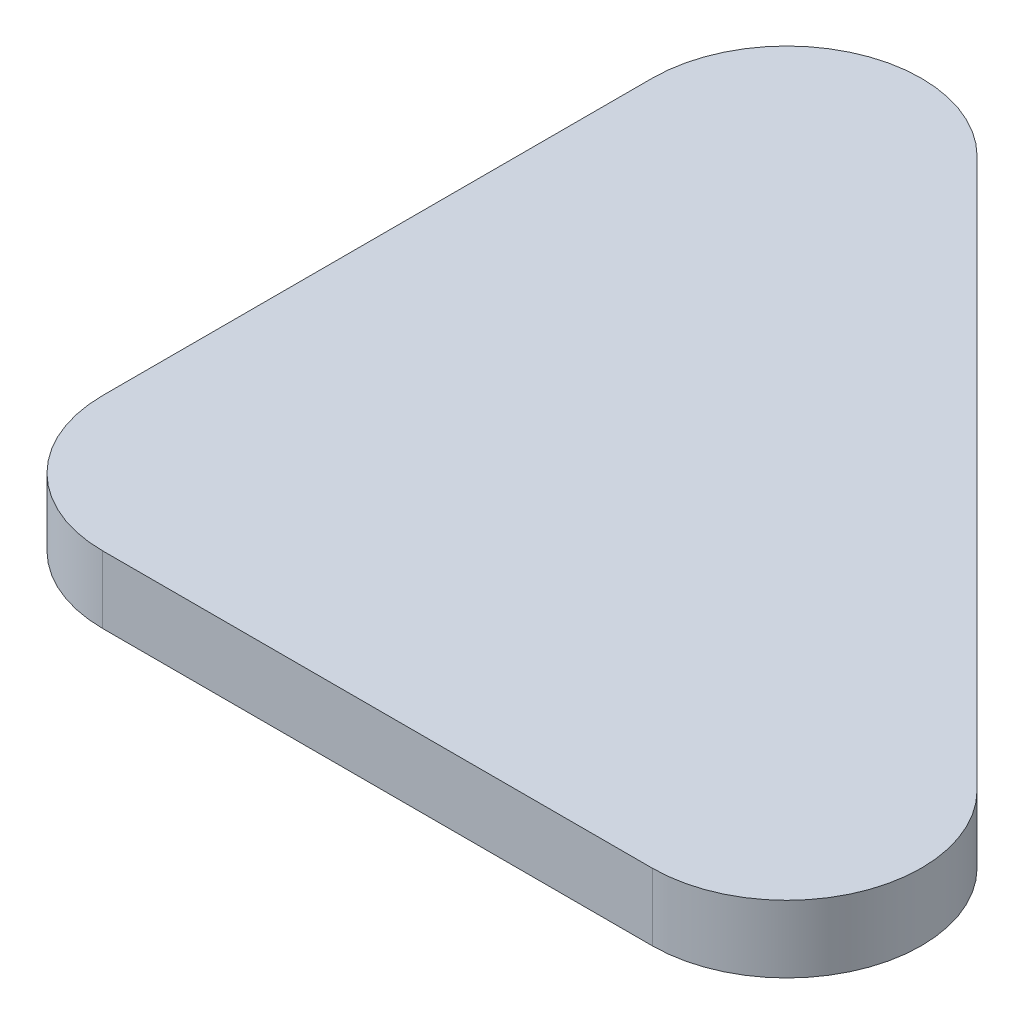
ISO-10303-21;
HEADER;
FILE_DESCRIPTION(('STEP AP214'),'2;1');
FILE_NAME('part.step','',(''),(''),'','','');
FILE_SCHEMA(('AUTOMOTIVE_DESIGN { 1 0 10303 214 1 1 1 1 }'));
ENDSEC;
DATA;
#1=APPLICATION_CONTEXT('core data for automotive mechanical design processes');
#2=APPLICATION_PROTOCOL_DEFINITION('international standard','automotive_design',2000,#1);
#3=PRODUCT_CONTEXT('',#1,'mechanical');
#4=PRODUCT('Part','Part','',(#3));
#5=PRODUCT_RELATED_PRODUCT_CATEGORY('part','',(#4));
#6=PRODUCT_DEFINITION_FORMATION('','',#4);
#7=PRODUCT_DEFINITION_CONTEXT('part definition',#1,'design');
#8=PRODUCT_DEFINITION('design','',#6,#7);
#9=PRODUCT_DEFINITION_SHAPE('','',#8);
#10=(LENGTH_UNIT() NAMED_UNIT(*) SI_UNIT(.MILLI.,.METRE.));
#11=(NAMED_UNIT(*) PLANE_ANGLE_UNIT() SI_UNIT($,.RADIAN.));
#12=(NAMED_UNIT(*) SI_UNIT($,.STERADIAN.) SOLID_ANGLE_UNIT());
#13=UNCERTAINTY_MEASURE_WITH_UNIT(LENGTH_MEASURE(1.E-05),#10,'distance_accuracy_value','');
#14=(GEOMETRIC_REPRESENTATION_CONTEXT(3) GLOBAL_UNCERTAINTY_ASSIGNED_CONTEXT((#13)) GLOBAL_UNIT_ASSIGNED_CONTEXT((#10,
#11,#12)) REPRESENTATION_CONTEXT('',''));
#15=CARTESIAN_POINT('',(0.,0.,0.));
#16=DIRECTION('',(0.,0.,1.));
#17=DIRECTION('',(1.,0.,0.));
#18=AXIS2_PLACEMENT_3D('',#15,#16,#17);
#19=CARTESIAN_POINT('',(0.,4.,-60.));
#20=DIRECTION('',(1.,0.,0.));
#21=DIRECTION('',(0.,0.,-1.));
#22=AXIS2_PLACEMENT_3D('',#19,#20,#21);
#23=PLANE('',#22);
#24=DIRECTION('',(0.,0.,1.));
#25=VECTOR('',#24,1.);
#26=CARTESIAN_POINT('',(0.,4.,-60.));
#27=LINE('',#26,#25);
#28=CARTESIAN_POINT('',(0.,4.,-40.6862915010152));
#29=VERTEX_POINT('',#28);
#30=CARTESIAN_POINT('',(0.,4.,-8.));
#31=VERTEX_POINT('',#30);
#32=EDGE_CURVE('E107',#29,#31,#27,.T.);
#33=ORIENTED_EDGE('',*,*,#32,.F.);
#34=DIRECTION('',(0.,-1.,0.));
#35=VECTOR('',#34,1.);
#36=CARTESIAN_POINT('',(0.,4.,-40.6862915010152));
#37=LINE('',#36,#35);
#38=CARTESIAN_POINT('',(0.,0.,-40.6862915010152));
#39=VERTEX_POINT('',#38);
#40=EDGE_CURVE('E93',#29,#39,#37,.T.);
#41=ORIENTED_EDGE('',*,*,#40,.T.);
#42=DIRECTION('',(0.,0.,1.));
#43=VECTOR('',#42,1.);
#44=CARTESIAN_POINT('',(0.,0.,-60.));
#45=LINE('',#44,#43);
#46=CARTESIAN_POINT('',(0.,0.,-8.));
#47=VERTEX_POINT('',#46);
#48=EDGE_CURVE('E105',#39,#47,#45,.T.);
#49=ORIENTED_EDGE('',*,*,#48,.T.);
#50=DIRECTION('',(0.,-1.,0.));
#51=VECTOR('',#50,1.);
#52=CARTESIAN_POINT('',(0.,4.,-8.));
#53=LINE('',#52,#51);
#54=EDGE_CURVE('E109',#47,#31,#53,.F.);
#55=ORIENTED_EDGE('',*,*,#54,.T.);
#56=EDGE_LOOP('',(#33,#41,#49,#55));
#57=FACE_BOUND('',#56,.T.);
#58=ADVANCED_FACE('F35',(#57),#23,.F.);
#59=CARTESIAN_POINT('',(0.,4.,0.));
#60=DIRECTION('',(0.,0.,-1.));
#61=DIRECTION('',(-1.,0.,0.));
#62=AXIS2_PLACEMENT_3D('',#59,#60,#61);
#63=PLANE('',#62);
#64=DIRECTION('',(1.,0.,0.));
#65=VECTOR('',#64,1.);
#66=CARTESIAN_POINT('',(0.,4.,0.));
#67=LINE('',#66,#65);
#68=CARTESIAN_POINT('',(8.,4.,0.));
#69=VERTEX_POINT('',#68);
#70=CARTESIAN_POINT('',(40.6862915010152,4.,0.));
#71=VERTEX_POINT('',#70);
#72=EDGE_CURVE('E138',#69,#71,#67,.T.);
#73=ORIENTED_EDGE('',*,*,#72,.F.);
#74=DIRECTION('',(0.,-1.,0.));
#75=VECTOR('',#74,1.);
#76=CARTESIAN_POINT('',(8.,4.,0.));
#77=LINE('',#76,#75);
#78=CARTESIAN_POINT('',(8.,0.,0.));
#79=VERTEX_POINT('',#78);
#80=EDGE_CURVE('E11',#69,#79,#77,.T.);
#81=ORIENTED_EDGE('',*,*,#80,.T.);
#82=DIRECTION('',(1.,0.,0.));
#83=VECTOR('',#82,1.);
#84=CARTESIAN_POINT('',(0.,0.,0.));
#85=LINE('',#84,#83);
#86=CARTESIAN_POINT('',(40.6862915010152,0.,0.));
#87=VERTEX_POINT('',#86);
#88=EDGE_CURVE('E113',#79,#87,#85,.T.);
#89=ORIENTED_EDGE('',*,*,#88,.T.);
#90=DIRECTION('',(0.,-1.,0.));
#91=VECTOR('',#90,1.);
#92=CARTESIAN_POINT('',(40.6862915010152,4.,0.));
#93=LINE('',#92,#91);
#94=EDGE_CURVE('E43',#87,#71,#93,.F.);
#95=ORIENTED_EDGE('',*,*,#94,.T.);
#96=EDGE_LOOP('',(#73,#81,#89,#95));
#97=FACE_BOUND('',#96,.T.);
#98=ADVANCED_FACE('F143',(#97),#63,.F.);
#99=CARTESIAN_POINT('',(60.,4.,0.));
#100=DIRECTION('',(-0.707106781186547,0.,0.707106781186547));
#101=DIRECTION('',(0.707106781186548,0.,0.707106781186548));
#102=AXIS2_PLACEMENT_3D('',#99,#100,#101);
#103=PLANE('',#102);
#104=DIRECTION('',(-0.707106781186547,0.,-0.707106781186547));
#105=VECTOR('',#104,1.);
#106=CARTESIAN_POINT('',(60.,0.,0.));
#107=LINE('',#106,#105);
#108=CARTESIAN_POINT('',(46.3431457505076,0.,-13.6568542494924));
#109=VERTEX_POINT('',#108);
#110=CARTESIAN_POINT('',(13.6568542494924,0.,-46.3431457505076));
#111=VERTEX_POINT('',#110);
#112=EDGE_CURVE('E115',#109,#111,#107,.T.);
#113=ORIENTED_EDGE('',*,*,#112,.T.);
#114=DIRECTION('',(0.,-1.,0.));
#115=VECTOR('',#114,1.);
#116=CARTESIAN_POINT('',(13.6568542494924,4.,-46.3431457505076));
#117=LINE('',#116,#115);
#118=CARTESIAN_POINT('',(13.6568542494924,4.,-46.3431457505076));
#119=VERTEX_POINT('',#118);
#120=EDGE_CURVE('E94',#111,#119,#117,.F.);
#121=ORIENTED_EDGE('',*,*,#120,.T.);
#122=DIRECTION('',(-0.707106781186547,0.,-0.707106781186547));
#123=VECTOR('',#122,1.);
#124=CARTESIAN_POINT('',(60.,4.,0.));
#125=LINE('',#124,#123);
#126=CARTESIAN_POINT('',(46.3431457505076,4.,-13.6568542494924));
#127=VERTEX_POINT('',#126);
#128=EDGE_CURVE('E118',#127,#119,#125,.T.);
#129=ORIENTED_EDGE('',*,*,#128,.F.);
#130=DIRECTION('',(0.,-1.,0.));
#131=VECTOR('',#130,1.);
#132=CARTESIAN_POINT('',(46.3431457505076,4.,-13.6568542494924));
#133=LINE('',#132,#131);
#134=EDGE_CURVE('E99',#127,#109,#133,.T.);
#135=ORIENTED_EDGE('',*,*,#134,.T.);
#136=EDGE_LOOP('',(#113,#121,#129,#135));
#137=FACE_BOUND('',#136,.T.);
#138=ADVANCED_FACE('F142',(#137),#103,.F.);
#139=CARTESIAN_POINT('',(0.,4.,0.));
#140=DIRECTION('',(0.,1.,0.));
#141=DIRECTION('',(0.,0.,1.));
#142=AXIS2_PLACEMENT_3D('',#139,#140,#141);
#143=PLANE('',#142);
#144=ORIENTED_EDGE('',*,*,#128,.T.);
#145=CARTESIAN_POINT('',(8.,4.,-40.6862915010152));
#146=DIRECTION('',(0.,1.,0.));
#147=DIRECTION('',(0.,0.,1.));
#148=AXIS2_PLACEMENT_3D('',#145,#146,#147);
#149=CIRCLE('',#148,8.);
#150=EDGE_CURVE('E131',#119,#29,#149,.T.);
#151=ORIENTED_EDGE('',*,*,#150,.T.);
#152=ORIENTED_EDGE('',*,*,#32,.T.);
#153=CARTESIAN_POINT('',(8.,4.,-8.));
#154=DIRECTION('',(0.,1.,0.));
#155=DIRECTION('',(0.,0.,1.));
#156=AXIS2_PLACEMENT_3D('',#153,#154,#155);
#157=CIRCLE('',#156,8.);
#158=EDGE_CURVE('E56',#31,#69,#157,.T.);
#159=ORIENTED_EDGE('',*,*,#158,.T.);
#160=ORIENTED_EDGE('',*,*,#72,.T.);
#161=CARTESIAN_POINT('',(40.6862915010152,4.,-8.));
#162=DIRECTION('',(0.,1.,0.));
#163=DIRECTION('',(0.,0.,1.));
#164=AXIS2_PLACEMENT_3D('',#161,#162,#163);
#165=CIRCLE('',#164,8.);
#166=EDGE_CURVE('E128',#71,#127,#165,.T.);
#167=ORIENTED_EDGE('',*,*,#166,.T.);
#168=EDGE_LOOP('',(#144,#151,#152,#159,#160,#167));
#169=FACE_BOUND('',#168,.T.);
#170=ADVANCED_FACE('F133',(#169),#143,.T.);
#171=CARTESIAN_POINT('',(0.,0.,0.));
#172=DIRECTION('',(0.,1.,0.));
#173=DIRECTION('',(0.,0.,1.));
#174=AXIS2_PLACEMENT_3D('',#171,#172,#173);
#175=PLANE('',#174);
#176=ORIENTED_EDGE('',*,*,#48,.F.);
#177=CARTESIAN_POINT('',(8.,0.,-40.6862915010152));
#178=DIRECTION('',(0.,1.,0.));
#179=DIRECTION('',(0.,0.,1.));
#180=AXIS2_PLACEMENT_3D('',#177,#178,#179);
#181=CIRCLE('',#180,8.);
#182=EDGE_CURVE('E89',#39,#111,#181,.F.);
#183=ORIENTED_EDGE('',*,*,#182,.T.);
#184=ORIENTED_EDGE('',*,*,#112,.F.);
#185=CARTESIAN_POINT('',(40.6862915010152,0.,-8.));
#186=DIRECTION('',(0.,1.,0.));
#187=DIRECTION('',(0.,0.,1.));
#188=AXIS2_PLACEMENT_3D('',#185,#186,#187);
#189=CIRCLE('',#188,8.);
#190=EDGE_CURVE('E108',#109,#87,#189,.F.);
#191=ORIENTED_EDGE('',*,*,#190,.T.);
#192=ORIENTED_EDGE('',*,*,#88,.F.);
#193=CARTESIAN_POINT('',(8.,0.,-8.));
#194=DIRECTION('',(0.,1.,0.));
#195=DIRECTION('',(0.,0.,1.));
#196=AXIS2_PLACEMENT_3D('',#193,#194,#195);
#197=CIRCLE('',#196,8.);
#198=EDGE_CURVE('E100',#79,#47,#197,.F.);
#199=ORIENTED_EDGE('',*,*,#198,.T.);
#200=EDGE_LOOP('',(#176,#183,#184,#191,#192,#199));
#201=FACE_BOUND('',#200,.T.);
#202=ADVANCED_FACE('F111',(#201),#175,.F.);
#203=CARTESIAN_POINT('',(8.,4.,-40.6862915010152));
#204=DIRECTION('',(0.,-1.,0.));
#205=DIRECTION('',(0.,0.,-1.));
#206=AXIS2_PLACEMENT_3D('',#203,#204,#205);
#207=CYLINDRICAL_SURFACE('',#206,8.);
#208=ORIENTED_EDGE('',*,*,#150,.F.);
#209=ORIENTED_EDGE('',*,*,#120,.F.);
#210=ORIENTED_EDGE('',*,*,#182,.F.);
#211=ORIENTED_EDGE('',*,*,#40,.F.);
#212=EDGE_LOOP('',(#208,#209,#210,#211));
#213=FACE_BOUND('',#212,.T.);
#214=ADVANCED_FACE('F92',(#213),#207,.T.);
#215=CARTESIAN_POINT('',(8.,4.,-8.));
#216=DIRECTION('',(0.,-1.,0.));
#217=DIRECTION('',(0.,0.,-1.));
#218=AXIS2_PLACEMENT_3D('',#215,#216,#217);
#219=CYLINDRICAL_SURFACE('',#218,8.);
#220=ORIENTED_EDGE('',*,*,#158,.F.);
#221=ORIENTED_EDGE('',*,*,#54,.F.);
#222=ORIENTED_EDGE('',*,*,#198,.F.);
#223=ORIENTED_EDGE('',*,*,#80,.F.);
#224=EDGE_LOOP('',(#220,#221,#222,#223));
#225=FACE_BOUND('',#224,.T.);
#226=ADVANCED_FACE('F145',(#225),#219,.T.);
#227=CARTESIAN_POINT('',(40.6862915010152,4.,-8.));
#228=DIRECTION('',(0.,-1.,0.));
#229=DIRECTION('',(0.,0.,-1.));
#230=AXIS2_PLACEMENT_3D('',#227,#228,#229);
#231=CYLINDRICAL_SURFACE('',#230,8.);
#232=ORIENTED_EDGE('',*,*,#166,.F.);
#233=ORIENTED_EDGE('',*,*,#94,.F.);
#234=ORIENTED_EDGE('',*,*,#190,.F.);
#235=ORIENTED_EDGE('',*,*,#134,.F.);
#236=EDGE_LOOP('',(#232,#233,#234,#235));
#237=FACE_BOUND('',#236,.T.);
#238=ADVANCED_FACE('F37',(#237),#231,.T.);
#239=CLOSED_SHELL('',(#58,#98,#138,#170,#202,#214,#226,#238));
#240=MANIFOLD_SOLID_BREP('B2',#239);
#241=ADVANCED_BREP_SHAPE_REPRESENTATION('',(#18,#240),#14);
#242=SHAPE_DEFINITION_REPRESENTATION(#9,#241);
ENDSEC;
END-ISO-10303-21;
